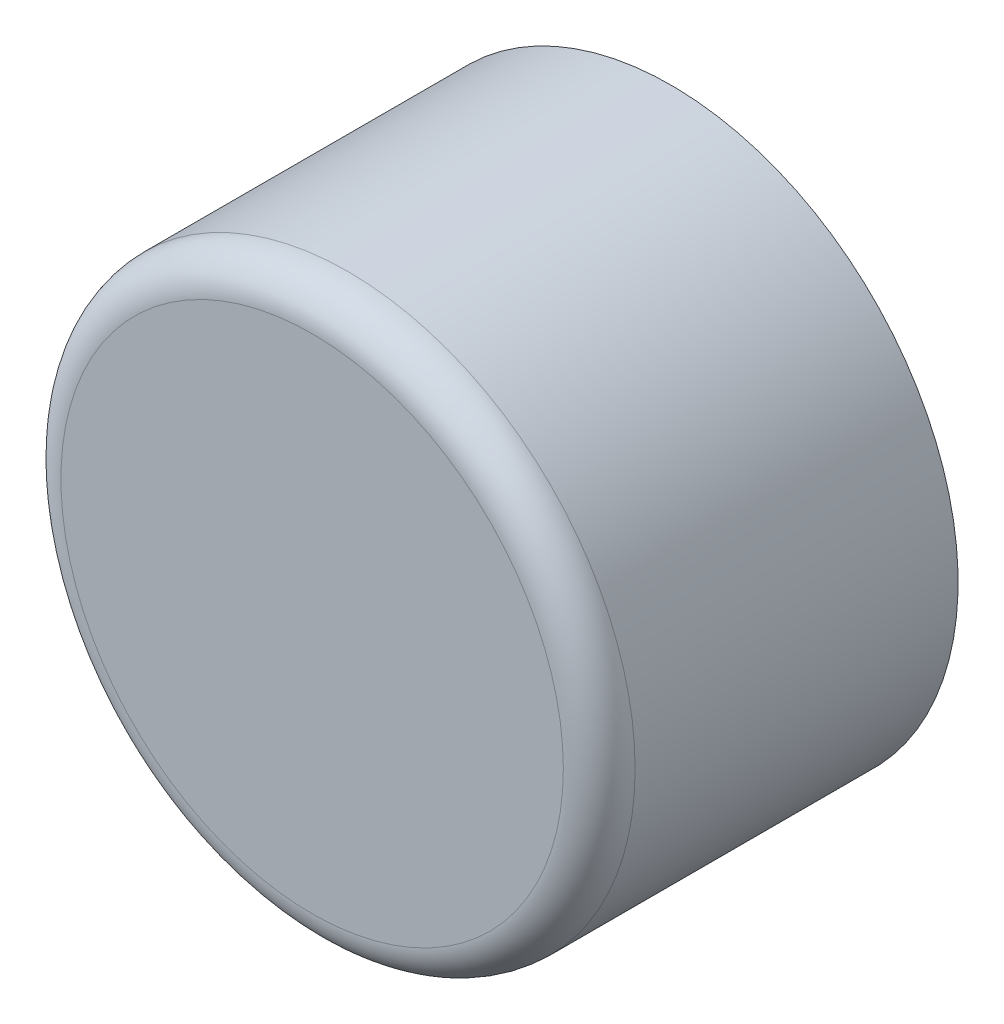
ISO-10303-21;
HEADER;
FILE_DESCRIPTION(('STEP AP214'),'2;1');
FILE_NAME('part.step','',(''),(''),'','','');
FILE_SCHEMA(('AUTOMOTIVE_DESIGN { 1 0 10303 214 1 1 1 1 }'));
ENDSEC;
DATA;
#1=APPLICATION_CONTEXT('core data for automotive mechanical design processes');
#2=APPLICATION_PROTOCOL_DEFINITION('international standard','automotive_design',2000,#1);
#3=PRODUCT_CONTEXT('',#1,'mechanical');
#4=PRODUCT('Part','Part','',(#3));
#5=PRODUCT_RELATED_PRODUCT_CATEGORY('part','',(#4));
#6=PRODUCT_DEFINITION_FORMATION('','',#4);
#7=PRODUCT_DEFINITION_CONTEXT('part definition',#1,'design');
#8=PRODUCT_DEFINITION('design','',#6,#7);
#9=PRODUCT_DEFINITION_SHAPE('','',#8);
#10=(LENGTH_UNIT() NAMED_UNIT(*) SI_UNIT(.MILLI.,.METRE.));
#11=(NAMED_UNIT(*) PLANE_ANGLE_UNIT() SI_UNIT($,.RADIAN.));
#12=(NAMED_UNIT(*) SI_UNIT($,.STERADIAN.) SOLID_ANGLE_UNIT());
#13=UNCERTAINTY_MEASURE_WITH_UNIT(LENGTH_MEASURE(1.E-05),#10,'distance_accuracy_value','');
#14=(GEOMETRIC_REPRESENTATION_CONTEXT(3) GLOBAL_UNCERTAINTY_ASSIGNED_CONTEXT((#13)) GLOBAL_UNIT_ASSIGNED_CONTEXT((#10,
#11,#12)) REPRESENTATION_CONTEXT('',''));
#15=CARTESIAN_POINT('',(0.,0.,0.));
#16=DIRECTION('',(0.,0.,1.));
#17=DIRECTION('',(1.,0.,0.));
#18=AXIS2_PLACEMENT_3D('',#15,#16,#17);
#19=CARTESIAN_POINT('',(0.,0.,100.));
#20=DIRECTION('',(0.,0.,-1.));
#21=DIRECTION('',(-1.,0.,0.));
#22=AXIS2_PLACEMENT_3D('',#19,#20,#21);
#23=CYLINDRICAL_SURFACE('',#22,80.);
#24=CARTESIAN_POINT('',(0.,0.,90.));
#25=DIRECTION('',(0.,0.,1.));
#26=DIRECTION('',(1.,0.,0.));
#27=AXIS2_PLACEMENT_3D('',#24,#25,#26);
#28=CIRCLE('',#27,80.);
#29=CARTESIAN_POINT('',(-80.,0.,90.));
#30=VERTEX_POINT('',#29);
#31=EDGE_CURVE('E10',#30,#30,#28,.F.);
#32=CARTESIAN_POINT('',(0.,0.,0.));
#33=DIRECTION('',(0.,0.,1.));
#34=DIRECTION('',(1.,0.,0.));
#35=AXIS2_PLACEMENT_3D('',#32,#33,#34);
#36=CIRCLE('',#35,80.);
#37=CARTESIAN_POINT('',(-80.,0.,0.));
#38=VERTEX_POINT('',#37);
#39=EDGE_CURVE('E54',#38,#38,#36,.T.);
#40=CARTESIAN_POINT('',(-80.,0.,90.));
#41=CARTESIAN_POINT('',(-80.,0.,89.0625));
#42=CARTESIAN_POINT('',(-80.,0.,88.125));
#43=CARTESIAN_POINT('',(-80.,0.,86.25));
#44=CARTESIAN_POINT('',(-80.,0.,85.3125));
#45=CARTESIAN_POINT('',(-80.,0.,83.4375));
#46=CARTESIAN_POINT('',(-80.,0.,82.5));
#47=CARTESIAN_POINT('',(-80.,0.,80.625));
#48=CARTESIAN_POINT('',(-80.,0.,79.6875));
#49=CARTESIAN_POINT('',(-80.,0.,77.8125));
#50=CARTESIAN_POINT('',(-80.,0.,76.875));
#51=CARTESIAN_POINT('',(-80.,0.,75.));
#52=CARTESIAN_POINT('',(-80.,0.,74.0625));
#53=CARTESIAN_POINT('',(-80.,0.,72.1875));
#54=CARTESIAN_POINT('',(-80.,0.,71.25));
#55=CARTESIAN_POINT('',(-80.,0.,69.375));
#56=CARTESIAN_POINT('',(-80.,0.,68.4375));
#57=CARTESIAN_POINT('',(-80.,0.,66.5625));
#58=CARTESIAN_POINT('',(-80.,0.,65.625));
#59=CARTESIAN_POINT('',(-80.,0.,63.75));
#60=CARTESIAN_POINT('',(-80.,0.,62.8125));
#61=CARTESIAN_POINT('',(-80.,0.,60.9375));
#62=CARTESIAN_POINT('',(-80.,0.,60.));
#63=CARTESIAN_POINT('',(-80.,0.,58.125));
#64=CARTESIAN_POINT('',(-80.,0.,57.1875));
#65=CARTESIAN_POINT('',(-80.,0.,55.3125));
#66=CARTESIAN_POINT('',(-80.,0.,54.375));
#67=CARTESIAN_POINT('',(-80.,0.,52.5));
#68=CARTESIAN_POINT('',(-80.,0.,51.5625));
#69=CARTESIAN_POINT('',(-80.,0.,49.6875));
#70=CARTESIAN_POINT('',(-80.,0.,48.75));
#71=CARTESIAN_POINT('',(-80.,0.,46.875));
#72=CARTESIAN_POINT('',(-80.,0.,45.9375));
#73=CARTESIAN_POINT('',(-80.,0.,44.0625));
#74=CARTESIAN_POINT('',(-80.,0.,43.125));
#75=CARTESIAN_POINT('',(-80.,0.,41.25));
#76=CARTESIAN_POINT('',(-80.,0.,40.3125));
#77=CARTESIAN_POINT('',(-80.,0.,38.4375));
#78=CARTESIAN_POINT('',(-80.,0.,37.5));
#79=CARTESIAN_POINT('',(-80.,0.,35.625));
#80=CARTESIAN_POINT('',(-80.,0.,34.6875));
#81=CARTESIAN_POINT('',(-80.,0.,32.8125));
#82=CARTESIAN_POINT('',(-80.,0.,31.875));
#83=CARTESIAN_POINT('',(-80.,0.,30.));
#84=CARTESIAN_POINT('',(-80.,0.,29.0625));
#85=CARTESIAN_POINT('',(-80.,0.,27.1875));
#86=CARTESIAN_POINT('',(-80.,0.,26.25));
#87=CARTESIAN_POINT('',(-80.,0.,24.375));
#88=CARTESIAN_POINT('',(-80.,0.,23.4375));
#89=CARTESIAN_POINT('',(-80.,0.,21.5625));
#90=CARTESIAN_POINT('',(-80.,0.,20.625));
#91=CARTESIAN_POINT('',(-80.,0.,18.75));
#92=CARTESIAN_POINT('',(-80.,0.,17.8125));
#93=CARTESIAN_POINT('',(-80.,0.,15.9375));
#94=CARTESIAN_POINT('',(-80.,0.,15.));
#95=CARTESIAN_POINT('',(-80.,0.,13.125));
#96=CARTESIAN_POINT('',(-80.,0.,12.1875));
#97=CARTESIAN_POINT('',(-80.,0.,10.3125));
#98=CARTESIAN_POINT('',(-80.,0.,9.375));
#99=CARTESIAN_POINT('',(-80.,0.,7.5));
#100=CARTESIAN_POINT('',(-80.,0.,6.5625));
#101=CARTESIAN_POINT('',(-80.,0.,4.6875));
#102=CARTESIAN_POINT('',(-80.,0.,3.75));
#103=CARTESIAN_POINT('',(-80.,0.,1.875));
#104=CARTESIAN_POINT('',(-80.,0.,0.9375));
#105=CARTESIAN_POINT('',(-80.,0.,0.));
#106=B_SPLINE_CURVE_WITH_KNOTS('',3,(#40,#41,#42,#43,#44,#45,#46,#47,#48,#49,#50,#51,#52,#53,
#54,#55,#56,#57,#58,#59,#60,#61,#62,#63,#64,#65,#66,#67,#68,#69,#70,#71,#72,#73,#74,#75,#76,#77,
#78,#79,#80,#81,#82,#83,#84,#85,#86,#87,#88,#89,#90,#91,#92,#93,#94,#95,#96,#97,#98,#99,#100,
#101,#102,#103,#104,#105),.UNSPECIFIED.,.F.,.F.,(4,2,2,2,2,2,2,2,2,2,2,2,2,2,2,2,2,2,2,2,2,2,2,
2,2,2,2,2,2,2,2,2,4),(0.,2.8125,5.62499999999999,8.4375,11.25,14.0625,16.875,19.6875,22.5,
25.3125,28.125,30.9375,33.75,36.5625,39.375,42.1875,45.,47.8125,50.625,53.4375,56.25,59.0625,
61.875,64.6875,67.5,70.3125,73.125,75.9375,78.75,81.5625,84.375,87.1875,90.),.UNSPECIFIED.);
#107=EDGE_CURVE('BSEAM41',#30,#38,#106,.T.);
#108=ORIENTED_EDGE('',*,*,#31,.T.);
#109=ORIENTED_EDGE('',*,*,#39,.T.);
#110=ORIENTED_EDGE('',*,*,#107,.T.);
#111=ORIENTED_EDGE('',*,*,#107,.F.);
#112=EDGE_LOOP('',(#108,#110,#109,#111));
#113=FACE_BOUND('',#112,.T.);
#114=ADVANCED_FACE('F41',(#113),#23,.T.);
#115=CARTESIAN_POINT('',(0.,0.,100.));
#116=DIRECTION('',(0.,0.,1.));
#117=DIRECTION('',(1.,0.,0.));
#118=AXIS2_PLACEMENT_3D('',#115,#116,#117);
#119=PLANE('',#118);
#120=CARTESIAN_POINT('',(0.,0.,100.));
#121=DIRECTION('',(0.,0.,1.));
#122=DIRECTION('',(1.,0.,0.));
#123=AXIS2_PLACEMENT_3D('',#120,#121,#122);
#124=CIRCLE('',#123,70.);
#125=CARTESIAN_POINT('',(70.,0.,100.));
#126=VERTEX_POINT('',#125);
#127=EDGE_CURVE('E49',#126,#126,#124,.T.);
#128=ORIENTED_EDGE('',*,*,#127,.T.);
#129=EDGE_LOOP('',(#128));
#130=FACE_BOUND('',#129,.T.);
#131=ADVANCED_FACE('F65',(#130),#119,.T.);
#132=CARTESIAN_POINT('',(0.,0.,0.));
#133=DIRECTION('',(0.,0.,1.));
#134=DIRECTION('',(1.,0.,0.));
#135=AXIS2_PLACEMENT_3D('',#132,#133,#134);
#136=PLANE('',#135);
#137=ORIENTED_EDGE('',*,*,#39,.F.);
#138=EDGE_LOOP('',(#137));
#139=FACE_BOUND('',#138,.T.);
#140=ADVANCED_FACE('F63',(#139),#136,.F.);
#141=CARTESIAN_POINT('',(0.,0.,90.));
#142=DIRECTION('',(0.,0.,1.));
#143=DIRECTION('',(1.,0.,0.));
#144=AXIS2_PLACEMENT_3D('',#141,#142,#143);
#145=TOROIDAL_SURFACE('',#144,70.,10.);
#146=ORIENTED_EDGE('',*,*,#31,.F.);
#147=EDGE_LOOP('',(#146));
#148=FACE_BOUND('',#147,.T.);
#149=ORIENTED_EDGE('',*,*,#127,.F.);
#150=EDGE_LOOP('',(#149));
#151=FACE_BOUND('',#150,.T.);
#152=ADVANCED_FACE('F43',(#148,#151),#145,.T.);
#153=CLOSED_SHELL('',(#114,#131,#140,#152));
#154=MANIFOLD_SOLID_BREP('B2',#153);
#155=ADVANCED_BREP_SHAPE_REPRESENTATION('',(#18,#154),#14);
#156=SHAPE_DEFINITION_REPRESENTATION(#9,#155);
ENDSEC;
END-ISO-10303-21;
